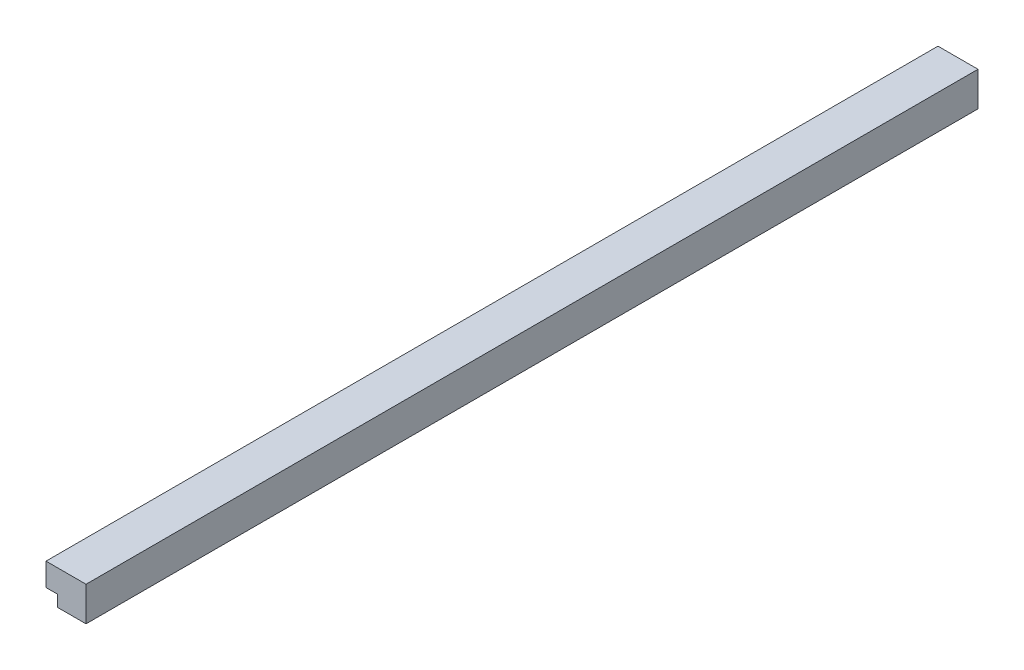
ISO-10303-21;
HEADER;
FILE_DESCRIPTION(('STEP AP214'),'2;1');
FILE_NAME('part.step','',(''),(''),'','','');
FILE_SCHEMA(('AUTOMOTIVE_DESIGN { 1 0 10303 214 1 1 1 1 }'));
ENDSEC;
DATA;
#1=APPLICATION_CONTEXT('core data for automotive mechanical design processes');
#2=APPLICATION_PROTOCOL_DEFINITION('international standard','automotive_design',2000,#1);
#3=PRODUCT_CONTEXT('',#1,'mechanical');
#4=PRODUCT('Part','Part','',(#3));
#5=PRODUCT_RELATED_PRODUCT_CATEGORY('part','',(#4));
#6=PRODUCT_DEFINITION_FORMATION('','',#4);
#7=PRODUCT_DEFINITION_CONTEXT('part definition',#1,'design');
#8=PRODUCT_DEFINITION('design','',#6,#7);
#9=PRODUCT_DEFINITION_SHAPE('','',#8);
#10=(LENGTH_UNIT() NAMED_UNIT(*) SI_UNIT(.MILLI.,.METRE.));
#11=(NAMED_UNIT(*) PLANE_ANGLE_UNIT() SI_UNIT($,.RADIAN.));
#12=(NAMED_UNIT(*) SI_UNIT($,.STERADIAN.) SOLID_ANGLE_UNIT());
#13=UNCERTAINTY_MEASURE_WITH_UNIT(LENGTH_MEASURE(1.E-05),#10,'distance_accuracy_value','');
#14=(GEOMETRIC_REPRESENTATION_CONTEXT(3) GLOBAL_UNCERTAINTY_ASSIGNED_CONTEXT((#13)) GLOBAL_UNIT_ASSIGNED_CONTEXT((#10,
#11,#12)) REPRESENTATION_CONTEXT('',''));
#15=CARTESIAN_POINT('',(0.,0.,0.));
#16=DIRECTION('',(0.,0.,1.));
#17=DIRECTION('',(1.,0.,0.));
#18=AXIS2_PLACEMENT_3D('',#15,#16,#17);
#19=CARTESIAN_POINT('',(0.,0.,-780.));
#20=DIRECTION('',(1.,0.,0.));
#21=DIRECTION('',(0.,0.,-1.));
#22=AXIS2_PLACEMENT_3D('',#19,#20,#21);
#23=PLANE('',#22);
#24=DIRECTION('',(0.,1.,0.));
#25=VECTOR('',#24,1.);
#26=CARTESIAN_POINT('',(0.,0.,0.));
#27=LINE('',#26,#25);
#28=CARTESIAN_POINT('',(0.,-20.,0.));
#29=VERTEX_POINT('',#28);
#30=CARTESIAN_POINT('',(0.,0.,0.));
#31=VERTEX_POINT('',#30);
#32=EDGE_CURVE('E120',#29,#31,#27,.T.);
#33=ORIENTED_EDGE('',*,*,#32,.T.);
#34=DIRECTION('',(0.,0.,1.));
#35=VECTOR('',#34,1.);
#36=CARTESIAN_POINT('',(0.,0.,-780.));
#37=LINE('',#36,#35);
#38=CARTESIAN_POINT('',(0.,0.,-780.));
#39=VERTEX_POINT('',#38);
#40=EDGE_CURVE('E11',#39,#31,#37,.T.);
#41=ORIENTED_EDGE('',*,*,#40,.F.);
#42=DIRECTION('',(0.,1.,0.));
#43=VECTOR('',#42,1.);
#44=CARTESIAN_POINT('',(0.,0.,-780.));
#45=LINE('',#44,#43);
#46=CARTESIAN_POINT('',(0.,-20.,-780.));
#47=VERTEX_POINT('',#46);
#48=EDGE_CURVE('E130',#47,#39,#45,.T.);
#49=ORIENTED_EDGE('',*,*,#48,.F.);
#50=DIRECTION('',(0.,0.,1.));
#51=VECTOR('',#50,1.);
#52=CARTESIAN_POINT('',(0.,-20.,-780.));
#53=LINE('',#52,#51);
#54=EDGE_CURVE('E116',#47,#29,#53,.T.);
#55=ORIENTED_EDGE('',*,*,#54,.T.);
#56=EDGE_LOOP('',(#33,#41,#49,#55));
#57=FACE_BOUND('',#56,.T.);
#58=ADVANCED_FACE('F36',(#57),#23,.F.);
#59=CARTESIAN_POINT('',(0.,0.,-780.));
#60=DIRECTION('',(0.,-1.,0.));
#61=DIRECTION('',(0.,0.,-1.));
#62=AXIS2_PLACEMENT_3D('',#59,#60,#61);
#63=PLANE('',#62);
#64=DIRECTION('',(1.,0.,0.));
#65=VECTOR('',#64,1.);
#66=CARTESIAN_POINT('',(0.,0.,0.));
#67=LINE('',#66,#65);
#68=CARTESIAN_POINT('',(35.,0.,0.));
#69=VERTEX_POINT('',#68);
#70=EDGE_CURVE('E123',#31,#69,#67,.T.);
#71=ORIENTED_EDGE('',*,*,#70,.T.);
#72=DIRECTION('',(0.,0.,1.));
#73=VECTOR('',#72,1.);
#74=CARTESIAN_POINT('',(35.,0.,-780.));
#75=LINE('',#74,#73);
#76=CARTESIAN_POINT('',(35.,0.,-780.));
#77=VERTEX_POINT('',#76);
#78=EDGE_CURVE('E44',#77,#69,#75,.T.);
#79=ORIENTED_EDGE('',*,*,#78,.F.);
#80=DIRECTION('',(1.,0.,0.));
#81=VECTOR('',#80,1.);
#82=CARTESIAN_POINT('',(0.,0.,-780.));
#83=LINE('',#82,#81);
#84=EDGE_CURVE('E89',#39,#77,#83,.T.);
#85=ORIENTED_EDGE('',*,*,#84,.F.);
#86=ORIENTED_EDGE('',*,*,#40,.T.);
#87=EDGE_LOOP('',(#71,#79,#85,#86));
#88=FACE_BOUND('',#87,.T.);
#89=ADVANCED_FACE('F154',(#88),#63,.F.);
#90=CARTESIAN_POINT('',(35.,0.,-780.));
#91=DIRECTION('',(-1.,0.,0.));
#92=DIRECTION('',(0.,0.,1.));
#93=AXIS2_PLACEMENT_3D('',#90,#91,#92);
#94=PLANE('',#93);
#95=DIRECTION('',(0.,-1.,0.));
#96=VECTOR('',#95,1.);
#97=CARTESIAN_POINT('',(35.,0.,0.));
#98=LINE('',#97,#96);
#99=CARTESIAN_POINT('',(35.,-30.,0.));
#100=VERTEX_POINT('',#99);
#101=EDGE_CURVE('E125',#69,#100,#98,.T.);
#102=ORIENTED_EDGE('',*,*,#101,.T.);
#103=DIRECTION('',(0.,0.,1.));
#104=VECTOR('',#103,1.);
#105=CARTESIAN_POINT('',(35.,-30.,-780.));
#106=LINE('',#105,#104);
#107=CARTESIAN_POINT('',(35.,-30.,-780.));
#108=VERTEX_POINT('',#107);
#109=EDGE_CURVE('E111',#108,#100,#106,.T.);
#110=ORIENTED_EDGE('',*,*,#109,.F.);
#111=DIRECTION('',(0.,-1.,0.));
#112=VECTOR('',#111,1.);
#113=CARTESIAN_POINT('',(35.,0.,-780.));
#114=LINE('',#113,#112);
#115=EDGE_CURVE('E102',#77,#108,#114,.T.);
#116=ORIENTED_EDGE('',*,*,#115,.F.);
#117=ORIENTED_EDGE('',*,*,#78,.T.);
#118=EDGE_LOOP('',(#102,#110,#116,#117));
#119=FACE_BOUND('',#118,.T.);
#120=ADVANCED_FACE('F136',(#119),#94,.F.);
#121=CARTESIAN_POINT('',(10.,-30.,-780.));
#122=DIRECTION('',(0.,1.,0.));
#123=DIRECTION('',(0.,0.,1.));
#124=AXIS2_PLACEMENT_3D('',#121,#122,#123);
#125=PLANE('',#124);
#126=DIRECTION('',(-1.,0.,0.));
#127=VECTOR('',#126,1.);
#128=CARTESIAN_POINT('',(10.,-30.,0.));
#129=LINE('',#128,#127);
#130=CARTESIAN_POINT('',(10.,-30.,0.));
#131=VERTEX_POINT('',#130);
#132=EDGE_CURVE('E110',#100,#131,#129,.T.);
#133=ORIENTED_EDGE('',*,*,#132,.T.);
#134=DIRECTION('',(0.,0.,1.));
#135=VECTOR('',#134,1.);
#136=CARTESIAN_POINT('',(10.,-30.,-780.));
#137=LINE('',#136,#135);
#138=CARTESIAN_POINT('',(10.,-30.,-780.));
#139=VERTEX_POINT('',#138);
#140=EDGE_CURVE('E107',#139,#131,#137,.T.);
#141=ORIENTED_EDGE('',*,*,#140,.F.);
#142=DIRECTION('',(-1.,0.,0.));
#143=VECTOR('',#142,1.);
#144=CARTESIAN_POINT('',(10.,-30.,-780.));
#145=LINE('',#144,#143);
#146=EDGE_CURVE('E96',#108,#139,#145,.T.);
#147=ORIENTED_EDGE('',*,*,#146,.F.);
#148=ORIENTED_EDGE('',*,*,#109,.T.);
#149=EDGE_LOOP('',(#133,#141,#147,#148));
#150=FACE_BOUND('',#149,.T.);
#151=ADVANCED_FACE('F108',(#150),#125,.F.);
#152=CARTESIAN_POINT('',(10.,-20.,-780.));
#153=DIRECTION('',(1.,0.,0.));
#154=DIRECTION('',(0.,0.,-1.));
#155=AXIS2_PLACEMENT_3D('',#152,#153,#154);
#156=PLANE('',#155);
#157=DIRECTION('',(0.,1.,0.));
#158=VECTOR('',#157,1.);
#159=CARTESIAN_POINT('',(10.,-20.,0.));
#160=LINE('',#159,#158);
#161=CARTESIAN_POINT('',(10.,-20.,0.));
#162=VERTEX_POINT('',#161);
#163=EDGE_CURVE('E75',#131,#162,#160,.T.);
#164=ORIENTED_EDGE('',*,*,#163,.T.);
#165=DIRECTION('',(0.,0.,1.));
#166=VECTOR('',#165,1.);
#167=CARTESIAN_POINT('',(10.,-20.,-780.));
#168=LINE('',#167,#166);
#169=CARTESIAN_POINT('',(10.,-20.,-780.));
#170=VERTEX_POINT('',#169);
#171=EDGE_CURVE('E112',#170,#162,#168,.T.);
#172=ORIENTED_EDGE('',*,*,#171,.F.);
#173=DIRECTION('',(0.,1.,0.));
#174=VECTOR('',#173,1.);
#175=CARTESIAN_POINT('',(10.,-20.,-780.));
#176=LINE('',#175,#174);
#177=EDGE_CURVE('E100',#139,#170,#176,.T.);
#178=ORIENTED_EDGE('',*,*,#177,.F.);
#179=ORIENTED_EDGE('',*,*,#140,.T.);
#180=EDGE_LOOP('',(#164,#172,#178,#179));
#181=FACE_BOUND('',#180,.T.);
#182=ADVANCED_FACE('F114',(#181),#156,.F.);
#183=CARTESIAN_POINT('',(0.,-20.,-780.));
#184=DIRECTION('',(0.,1.,0.));
#185=DIRECTION('',(0.,0.,1.));
#186=AXIS2_PLACEMENT_3D('',#183,#184,#185);
#187=PLANE('',#186);
#188=DIRECTION('',(-1.,0.,0.));
#189=VECTOR('',#188,1.);
#190=CARTESIAN_POINT('',(0.,-20.,0.));
#191=LINE('',#190,#189);
#192=EDGE_CURVE('E81',#162,#29,#191,.T.);
#193=ORIENTED_EDGE('',*,*,#192,.T.);
#194=ORIENTED_EDGE('',*,*,#54,.F.);
#195=DIRECTION('',(-1.,0.,0.));
#196=VECTOR('',#195,1.);
#197=CARTESIAN_POINT('',(0.,-20.,-780.));
#198=LINE('',#197,#196);
#199=EDGE_CURVE('E52',#170,#47,#198,.T.);
#200=ORIENTED_EDGE('',*,*,#199,.F.);
#201=ORIENTED_EDGE('',*,*,#171,.T.);
#202=EDGE_LOOP('',(#193,#194,#200,#201));
#203=FACE_BOUND('',#202,.T.);
#204=ADVANCED_FACE('F143',(#203),#187,.F.);
#205=CARTESIAN_POINT('',(0.,0.,-780.));
#206=DIRECTION('',(0.,0.,1.));
#207=DIRECTION('',(1.,0.,0.));
#208=AXIS2_PLACEMENT_3D('',#205,#206,#207);
#209=PLANE('',#208);
#210=ORIENTED_EDGE('',*,*,#48,.T.);
#211=ORIENTED_EDGE('',*,*,#84,.T.);
#212=ORIENTED_EDGE('',*,*,#115,.T.);
#213=ORIENTED_EDGE('',*,*,#146,.T.);
#214=ORIENTED_EDGE('',*,*,#177,.T.);
#215=ORIENTED_EDGE('',*,*,#199,.T.);
#216=EDGE_LOOP('',(#210,#211,#212,#213,#214,#215));
#217=FACE_BOUND('',#216,.T.);
#218=ADVANCED_FACE('F98',(#217),#209,.F.);
#219=CARTESIAN_POINT('',(0.,0.,0.));
#220=DIRECTION('',(0.,0.,1.));
#221=DIRECTION('',(1.,0.,0.));
#222=AXIS2_PLACEMENT_3D('',#219,#220,#221);
#223=PLANE('',#222);
#224=ORIENTED_EDGE('',*,*,#32,.F.);
#225=ORIENTED_EDGE('',*,*,#192,.F.);
#226=ORIENTED_EDGE('',*,*,#163,.F.);
#227=ORIENTED_EDGE('',*,*,#132,.F.);
#228=ORIENTED_EDGE('',*,*,#101,.F.);
#229=ORIENTED_EDGE('',*,*,#70,.F.);
#230=EDGE_LOOP('',(#224,#225,#226,#227,#228,#229));
#231=FACE_BOUND('',#230,.T.);
#232=ADVANCED_FACE('F139',(#231),#223,.T.);
#233=CLOSED_SHELL('',(#58,#89,#120,#151,#182,#204,#218,#232));
#234=MANIFOLD_SOLID_BREP('B2',#233);
#235=ADVANCED_BREP_SHAPE_REPRESENTATION('',(#18,#234),#14);
#236=SHAPE_DEFINITION_REPRESENTATION(#9,#235);
ENDSEC;
END-ISO-10303-21;
